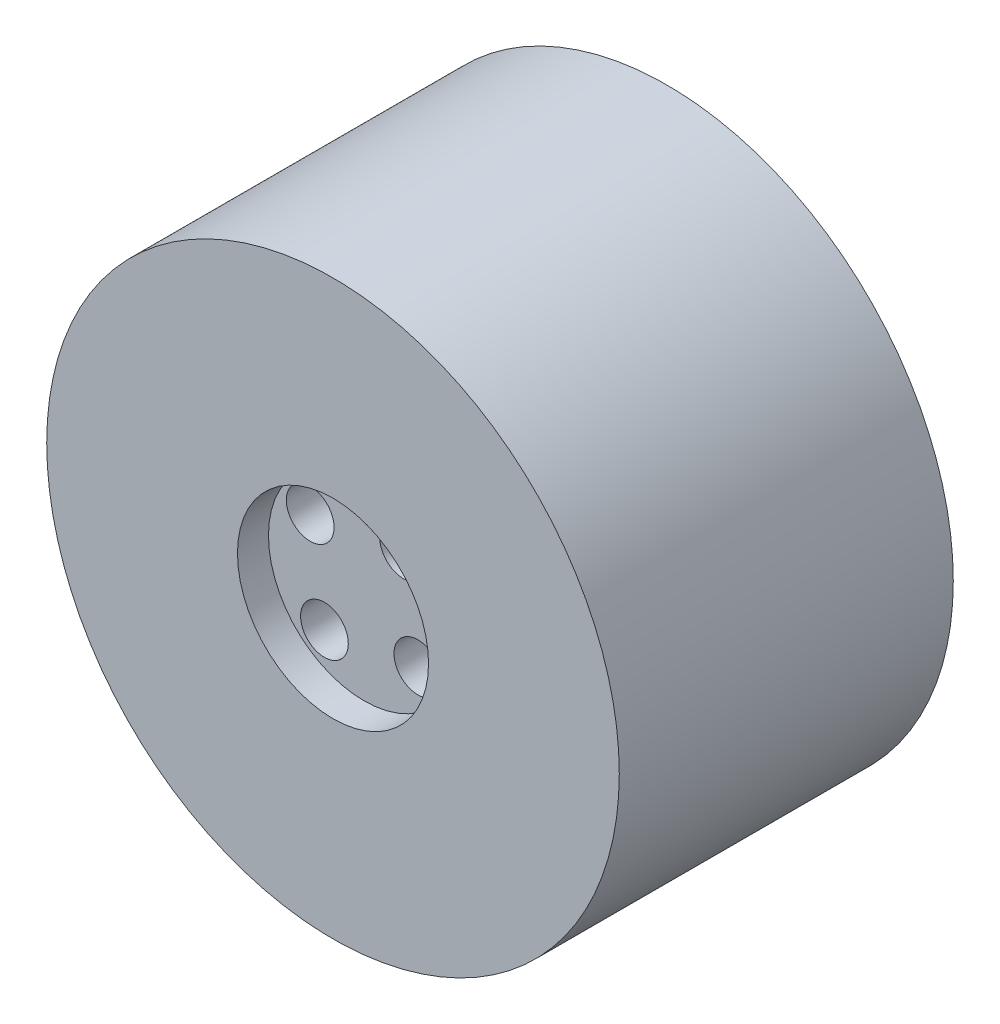
ISO-10303-21;
HEADER;
FILE_DESCRIPTION(('STEP AP214'),'2;1');
FILE_NAME('part.step','',(''),(''),'','','');
FILE_SCHEMA(('AUTOMOTIVE_DESIGN { 1 0 10303 214 1 1 1 1 }'));
ENDSEC;
DATA;
#1=APPLICATION_CONTEXT('core data for automotive mechanical design processes');
#2=APPLICATION_PROTOCOL_DEFINITION('international standard','automotive_design',2000,#1);
#3=PRODUCT_CONTEXT('',#1,'mechanical');
#4=PRODUCT('Part','Part','',(#3));
#5=PRODUCT_RELATED_PRODUCT_CATEGORY('part','',(#4));
#6=PRODUCT_DEFINITION_FORMATION('','',#4);
#7=PRODUCT_DEFINITION_CONTEXT('part definition',#1,'design');
#8=PRODUCT_DEFINITION('design','',#6,#7);
#9=PRODUCT_DEFINITION_SHAPE('','',#8);
#10=(LENGTH_UNIT() NAMED_UNIT(*) SI_UNIT(.MILLI.,.METRE.));
#11=(NAMED_UNIT(*) PLANE_ANGLE_UNIT() SI_UNIT($,.RADIAN.));
#12=(NAMED_UNIT(*) SI_UNIT($,.STERADIAN.) SOLID_ANGLE_UNIT());
#13=UNCERTAINTY_MEASURE_WITH_UNIT(LENGTH_MEASURE(1.E-05),#10,'distance_accuracy_value','');
#14=(GEOMETRIC_REPRESENTATION_CONTEXT(3) GLOBAL_UNCERTAINTY_ASSIGNED_CONTEXT((#13)) GLOBAL_UNIT_ASSIGNED_CONTEXT((#10,
#11,#12)) REPRESENTATION_CONTEXT('',''));
#15=CARTESIAN_POINT('',(0.,0.,0.));
#16=DIRECTION('',(0.,0.,1.));
#17=DIRECTION('',(1.,0.,0.));
#18=AXIS2_PLACEMENT_3D('',#15,#16,#17);
#19=CARTESIAN_POINT('',(0.,0.,70.));
#20=DIRECTION('',(0.,0.,-1.));
#21=DIRECTION('',(-1.,0.,0.));
#22=AXIS2_PLACEMENT_3D('',#19,#20,#21);
#23=CYLINDRICAL_SURFACE('',#22,60.);
#24=CARTESIAN_POINT('',(0.,0.,70.));
#25=DIRECTION('',(0.,0.,1.));
#26=DIRECTION('',(1.,0.,0.));
#27=AXIS2_PLACEMENT_3D('',#24,#25,#26);
#28=CIRCLE('',#27,60.);
#29=CARTESIAN_POINT('',(60.,0.,70.));
#30=VERTEX_POINT('',#29);
#31=EDGE_CURVE('E51',#30,#30,#28,.T.);
#32=ORIENTED_EDGE('',*,*,#31,.F.);
#33=EDGE_LOOP('',(#32));
#34=FACE_BOUND('',#33,.T.);
#35=CARTESIAN_POINT('',(0.,0.,0.));
#36=DIRECTION('',(0.,0.,1.));
#37=DIRECTION('',(1.,0.,0.));
#38=AXIS2_PLACEMENT_3D('',#35,#36,#37);
#39=CIRCLE('',#38,60.);
#40=CARTESIAN_POINT('',(60.,0.,0.));
#41=VERTEX_POINT('',#40);
#42=EDGE_CURVE('E46',#41,#41,#39,.T.);
#43=ORIENTED_EDGE('',*,*,#42,.T.);
#44=EDGE_LOOP('',(#43));
#45=FACE_BOUND('',#44,.T.);
#46=ADVANCED_FACE('F43',(#34,#45),#23,.T.);
#47=CARTESIAN_POINT('',(0.,0.,70.));
#48=DIRECTION('',(0.,0.,1.));
#49=DIRECTION('',(1.,0.,0.));
#50=AXIS2_PLACEMENT_3D('',#47,#48,#49);
#51=PLANE('',#50);
#52=CARTESIAN_POINT('',(0.,0.,70.));
#53=DIRECTION('',(0.,0.,1.));
#54=DIRECTION('',(1.,0.,0.));
#55=AXIS2_PLACEMENT_3D('',#52,#53,#54);
#56=CIRCLE('',#55,20.02);
#57=CARTESIAN_POINT('',(20.02,0.,70.));
#58=VERTEX_POINT('',#57);
#59=EDGE_CURVE('E65',#58,#58,#56,.T.);
#60=ORIENTED_EDGE('',*,*,#59,.F.);
#61=EDGE_LOOP('',(#60));
#62=FACE_BOUND('',#61,.T.);
#63=ORIENTED_EDGE('',*,*,#31,.T.);
#64=EDGE_LOOP('',(#63));
#65=FACE_BOUND('',#64,.T.);
#66=ADVANCED_FACE('F124',(#62,#65),#51,.T.);
#67=CARTESIAN_POINT('',(0.,0.,0.));
#68=DIRECTION('',(0.,0.,1.));
#69=DIRECTION('',(1.,0.,0.));
#70=AXIS2_PLACEMENT_3D('',#67,#68,#69);
#71=PLANE('',#70);
#72=CARTESIAN_POINT('',(0.,0.,0.));
#73=DIRECTION('',(0.,0.,-1.));
#74=DIRECTION('',(-1.,0.,0.));
#75=AXIS2_PLACEMENT_3D('',#72,#73,#74);
#76=CIRCLE('',#75,20.);
#77=CARTESIAN_POINT('',(-20.,0.,0.));
#78=VERTEX_POINT('',#77);
#79=EDGE_CURVE('E10',#78,#78,#76,.T.);
#80=ORIENTED_EDGE('',*,*,#79,.F.);
#81=EDGE_LOOP('',(#80));
#82=FACE_BOUND('',#81,.T.);
#83=ORIENTED_EDGE('',*,*,#42,.F.);
#84=EDGE_LOOP('',(#83));
#85=FACE_BOUND('',#84,.T.);
#86=ADVANCED_FACE('F129',(#82,#85),#71,.F.);
#87=CARTESIAN_POINT('',(0.,0.,63.5));
#88=DIRECTION('',(0.,0.,1.));
#89=DIRECTION('',(1.,0.,0.));
#90=AXIS2_PLACEMENT_3D('',#87,#88,#89);
#91=CYLINDRICAL_SURFACE('',#90,20.02);
#92=CARTESIAN_POINT('',(0.,0.,63.5));
#93=DIRECTION('',(0.,0.,1.));
#94=DIRECTION('',(1.,0.,0.));
#95=AXIS2_PLACEMENT_3D('',#92,#93,#94);
#96=CIRCLE('',#95,20.02);
#97=CARTESIAN_POINT('',(20.02,0.,63.5));
#98=VERTEX_POINT('',#97);
#99=EDGE_CURVE('E61',#98,#98,#96,.T.);
#100=CARTESIAN_POINT('',(20.02,0.,63.5));
#101=CARTESIAN_POINT('',(20.02,0.,63.5677083333333));
#102=CARTESIAN_POINT('',(20.02,0.,63.6354166666667));
#103=CARTESIAN_POINT('',(20.02,0.,63.7708333333333));
#104=CARTESIAN_POINT('',(20.02,0.,63.8385416666667));
#105=CARTESIAN_POINT('',(20.02,0.,63.9739583333333));
#106=CARTESIAN_POINT('',(20.02,0.,64.0416666666667));
#107=CARTESIAN_POINT('',(20.02,0.,64.1770833333333));
#108=CARTESIAN_POINT('',(20.02,0.,64.2447916666667));
#109=CARTESIAN_POINT('',(20.02,0.,64.3802083333333));
#110=CARTESIAN_POINT('',(20.02,0.,64.4479166666667));
#111=CARTESIAN_POINT('',(20.02,0.,64.5833333333333));
#112=CARTESIAN_POINT('',(20.02,0.,64.6510416666667));
#113=CARTESIAN_POINT('',(20.02,0.,64.7864583333333));
#114=CARTESIAN_POINT('',(20.02,0.,64.8541666666667));
#115=CARTESIAN_POINT('',(20.02,0.,64.9895833333333));
#116=CARTESIAN_POINT('',(20.02,0.,65.0572916666667));
#117=CARTESIAN_POINT('',(20.02,0.,65.1927083333333));
#118=CARTESIAN_POINT('',(20.02,0.,65.2604166666667));
#119=CARTESIAN_POINT('',(20.02,0.,65.3958333333333));
#120=CARTESIAN_POINT('',(20.02,0.,65.4635416666667));
#121=CARTESIAN_POINT('',(20.02,0.,65.5989583333333));
#122=CARTESIAN_POINT('',(20.02,0.,65.6666666666667));
#123=CARTESIAN_POINT('',(20.02,0.,65.8020833333333));
#124=CARTESIAN_POINT('',(20.02,0.,65.8697916666667));
#125=CARTESIAN_POINT('',(20.02,0.,66.0052083333333));
#126=CARTESIAN_POINT('',(20.02,0.,66.0729166666667));
#127=CARTESIAN_POINT('',(20.02,0.,66.2083333333333));
#128=CARTESIAN_POINT('',(20.02,0.,66.2760416666667));
#129=CARTESIAN_POINT('',(20.02,0.,66.4114583333333));
#130=CARTESIAN_POINT('',(20.02,0.,66.4791666666667));
#131=CARTESIAN_POINT('',(20.02,0.,66.6145833333333));
#132=CARTESIAN_POINT('',(20.02,0.,66.6822916666667));
#133=CARTESIAN_POINT('',(20.02,0.,66.8177083333333));
#134=CARTESIAN_POINT('',(20.02,0.,66.8854166666667));
#135=CARTESIAN_POINT('',(20.02,0.,67.0208333333333));
#136=CARTESIAN_POINT('',(20.02,0.,67.0885416666667));
#137=CARTESIAN_POINT('',(20.02,0.,67.2239583333333));
#138=CARTESIAN_POINT('',(20.02,0.,67.2916666666667));
#139=CARTESIAN_POINT('',(20.02,0.,67.4270833333333));
#140=CARTESIAN_POINT('',(20.02,0.,67.4947916666667));
#141=CARTESIAN_POINT('',(20.02,0.,67.6302083333333));
#142=CARTESIAN_POINT('',(20.02,0.,67.6979166666667));
#143=CARTESIAN_POINT('',(20.02,0.,67.8333333333333));
#144=CARTESIAN_POINT('',(20.02,0.,67.9010416666667));
#145=CARTESIAN_POINT('',(20.02,0.,68.0364583333333));
#146=CARTESIAN_POINT('',(20.02,0.,68.1041666666667));
#147=CARTESIAN_POINT('',(20.02,0.,68.2395833333333));
#148=CARTESIAN_POINT('',(20.02,0.,68.3072916666667));
#149=CARTESIAN_POINT('',(20.02,0.,68.4427083333333));
#150=CARTESIAN_POINT('',(20.02,0.,68.5104166666667));
#151=CARTESIAN_POINT('',(20.02,0.,68.6458333333333));
#152=CARTESIAN_POINT('',(20.02,0.,68.7135416666667));
#153=CARTESIAN_POINT('',(20.02,0.,68.8489583333333));
#154=CARTESIAN_POINT('',(20.02,0.,68.9166666666667));
#155=CARTESIAN_POINT('',(20.02,0.,69.0520833333333));
#156=CARTESIAN_POINT('',(20.02,0.,69.1197916666667));
#157=CARTESIAN_POINT('',(20.02,0.,69.2552083333333));
#158=CARTESIAN_POINT('',(20.02,0.,69.3229166666667));
#159=CARTESIAN_POINT('',(20.02,0.,69.4583333333333));
#160=CARTESIAN_POINT('',(20.02,0.,69.5260416666667));
#161=CARTESIAN_POINT('',(20.02,0.,69.6614583333333));
#162=CARTESIAN_POINT('',(20.02,0.,69.7291666666667));
#163=CARTESIAN_POINT('',(20.02,0.,69.8645833333333));
#164=CARTESIAN_POINT('',(20.02,0.,69.9322916666667));
#165=CARTESIAN_POINT('',(20.02,0.,70.));
#166=B_SPLINE_CURVE_WITH_KNOTS('',3,(#100,#101,#102,#103,#104,#105,#106,#107,#108,#109,#110,
#111,#112,#113,#114,#115,#116,#117,#118,#119,#120,#121,#122,#123,#124,#125,#126,#127,#128,#129,
#130,#131,#132,#133,#134,#135,#136,#137,#138,#139,#140,#141,#142,#143,#144,#145,#146,#147,#148,
#149,#150,#151,#152,#153,#154,#155,#156,#157,#158,#159,#160,#161,#162,#163,#164,#165),
.UNSPECIFIED.,.F.,.F.,(4,2,2,2,2,2,2,2,2,2,2,2,2,2,2,2,2,2,2,2,2,2,2,2,2,2,2,2,2,2,2,2,4),(0.,
0.203124999999998,0.406249999999997,0.609374999999995,0.812499999999994,1.01562499999999,
1.21874999999999,1.42187499999999,1.62499999999999,1.828125,2.03125,2.234375,2.4375,
2.64062499999999,2.84374999999999,3.04687499999999,3.24999999999999,3.453125,3.65625,3.859375,
4.0625,4.26562499999999,4.46874999999999,4.67187499999999,4.87499999999999,5.078125,5.28125,
5.484375,5.6875,5.890625,6.09374999999999,6.29687499999999,6.49999999999999),.UNSPECIFIED.);
#167=EDGE_CURVE('BSEAM139',#98,#58,#166,.T.);
#168=ORIENTED_EDGE('',*,*,#99,.F.);
#169=ORIENTED_EDGE('',*,*,#59,.T.);
#170=ORIENTED_EDGE('',*,*,#167,.T.);
#171=ORIENTED_EDGE('',*,*,#167,.F.);
#172=EDGE_LOOP('',(#168,#170,#169,#171));
#173=FACE_BOUND('',#172,.T.);
#174=ADVANCED_FACE('F139',(#173),#91,.F.);
#175=CARTESIAN_POINT('',(0.,0.,63.5));
#176=DIRECTION('',(0.,0.,1.));
#177=DIRECTION('',(1.,0.,0.));
#178=AXIS2_PLACEMENT_3D('',#175,#176,#177);
#179=PLANE('',#178);
#180=CARTESIAN_POINT('',(-8.29451145609633,-11.2783456102696,63.5));
#181=DIRECTION('',(0.,0.,1.));
#182=DIRECTION('',(1.,0.,0.));
#183=AXIS2_PLACEMENT_3D('',#180,#181,#182);
#184=CIRCLE('',#183,5.);
#185=CARTESIAN_POINT('',(-3.29451145609633,-11.2783456102696,63.5));
#186=VERTEX_POINT('',#185);
#187=EDGE_CURVE('E82',#186,#186,#184,.T.);
#188=ORIENTED_EDGE('',*,*,#187,.F.);
#189=EDGE_LOOP('',(#188));
#190=FACE_BOUND('',#189,.T.);
#191=CARTESIAN_POINT('',(11.2783456102695,-8.29451145609637,63.5));
#192=DIRECTION('',(0.,0.,1.));
#193=DIRECTION('',(1.,0.,0.));
#194=AXIS2_PLACEMENT_3D('',#191,#192,#193);
#195=CIRCLE('',#194,5.);
#196=CARTESIAN_POINT('',(16.2783456102695,-8.29451145609637,63.5));
#197=VERTEX_POINT('',#196);
#198=EDGE_CURVE('E88',#197,#197,#195,.T.);
#199=ORIENTED_EDGE('',*,*,#198,.F.);
#200=EDGE_LOOP('',(#199));
#201=FACE_BOUND('',#200,.T.);
#202=CARTESIAN_POINT('',(8.29451145609625,11.2783456102696,63.5));
#203=DIRECTION('',(0.,0.,1.));
#204=DIRECTION('',(1.,0.,0.));
#205=AXIS2_PLACEMENT_3D('',#202,#203,#204);
#206=CIRCLE('',#205,5.);
#207=CARTESIAN_POINT('',(13.2945114560963,11.2783456102696,63.5));
#208=VERTEX_POINT('',#207);
#209=EDGE_CURVE('E92',#208,#208,#206,.T.);
#210=ORIENTED_EDGE('',*,*,#209,.F.);
#211=EDGE_LOOP('',(#210));
#212=FACE_BOUND('',#211,.T.);
#213=CARTESIAN_POINT('',(-11.2783456102695,8.29451145609637,63.5));
#214=DIRECTION('',(0.,0.,1.));
#215=DIRECTION('',(1.,0.,0.));
#216=AXIS2_PLACEMENT_3D('',#213,#214,#215);
#217=CIRCLE('',#216,5.);
#218=CARTESIAN_POINT('',(-6.27834561026953,8.29451145609637,63.5));
#219=VERTEX_POINT('',#218);
#220=EDGE_CURVE('E72',#219,#219,#217,.T.);
#221=ORIENTED_EDGE('',*,*,#220,.F.);
#222=EDGE_LOOP('',(#221));
#223=FACE_BOUND('',#222,.T.);
#224=ORIENTED_EDGE('',*,*,#99,.T.);
#225=EDGE_LOOP('',(#224));
#226=FACE_BOUND('',#225,.T.);
#227=ADVANCED_FACE('F145',(#190,#201,#212,#223,#226),#179,.T.);
#228=CARTESIAN_POINT('',(0.,0.,-6.));
#229=DIRECTION('',(0.,0.,1.));
#230=DIRECTION('',(1.,0.,0.));
#231=AXIS2_PLACEMENT_3D('',#228,#229,#230);
#232=CYLINDRICAL_SURFACE('',#231,20.);
#233=CARTESIAN_POINT('',(0.,0.,-6.));
#234=DIRECTION('',(0.,0.,-1.));
#235=DIRECTION('',(-1.,0.,0.));
#236=AXIS2_PLACEMENT_3D('',#233,#234,#235);
#237=CIRCLE('',#236,20.);
#238=CARTESIAN_POINT('',(-20.,0.,-6.));
#239=VERTEX_POINT('',#238);
#240=EDGE_CURVE('E59',#239,#239,#237,.T.);
#241=ORIENTED_EDGE('',*,*,#240,.F.);
#242=EDGE_LOOP('',(#241));
#243=FACE_BOUND('',#242,.T.);
#244=ORIENTED_EDGE('',*,*,#79,.T.);
#245=EDGE_LOOP('',(#244));
#246=FACE_BOUND('',#245,.T.);
#247=ADVANCED_FACE('F151',(#243,#246),#232,.T.);
#248=CARTESIAN_POINT('',(0.,0.,-6.));
#249=DIRECTION('',(0.,0.,-1.));
#250=DIRECTION('',(-1.,0.,0.));
#251=AXIS2_PLACEMENT_3D('',#248,#249,#250);
#252=PLANE('',#251);
#253=CARTESIAN_POINT('',(-8.29451145609633,-11.2783456102696,-6.00000000000001));
#254=DIRECTION('',(0.,0.,1.));
#255=DIRECTION('',(0.,1.,0.));
#256=AXIS2_PLACEMENT_3D('',#253,#254,#255);
#257=CIRCLE('',#256,5.);
#258=CARTESIAN_POINT('',(-8.29451145609635,-6.27834561026956,-6.00000000000001));
#259=VERTEX_POINT('',#258);
#260=EDGE_CURVE('E96',#259,#259,#257,.T.);
#261=ORIENTED_EDGE('',*,*,#260,.T.);
#262=EDGE_LOOP('',(#261));
#263=FACE_BOUND('',#262,.T.);
#264=CARTESIAN_POINT('',(11.2783456102695,-8.29451145609637,-6.00000000000001));
#265=DIRECTION('',(0.,0.,1.));
#266=DIRECTION('',(-1.,0.,0.));
#267=AXIS2_PLACEMENT_3D('',#264,#265,#266);
#268=CIRCLE('',#267,5.);
#269=CARTESIAN_POINT('',(6.27834561026953,-8.29451145609637,-6.00000000000001));
#270=VERTEX_POINT('',#269);
#271=EDGE_CURVE('E101',#270,#270,#268,.T.);
#272=ORIENTED_EDGE('',*,*,#271,.T.);
#273=EDGE_LOOP('',(#272));
#274=FACE_BOUND('',#273,.T.);
#275=CARTESIAN_POINT('',(8.29451145609625,11.2783456102696,-6.00000000000001));
#276=DIRECTION('',(0.,0.,1.));
#277=DIRECTION('',(0.,-1.,0.));
#278=AXIS2_PLACEMENT_3D('',#275,#276,#277);
#279=CIRCLE('',#278,5.);
#280=CARTESIAN_POINT('',(8.2945114560963,6.27834561026962,-6.00000000000001));
#281=VERTEX_POINT('',#280);
#282=EDGE_CURVE('E97',#281,#281,#279,.T.);
#283=ORIENTED_EDGE('',*,*,#282,.T.);
#284=EDGE_LOOP('',(#283));
#285=FACE_BOUND('',#284,.T.);
#286=CARTESIAN_POINT('',(-11.2783456102695,8.29451145609637,-6.00000000000001));
#287=DIRECTION('',(0.,0.,1.));
#288=DIRECTION('',(1.,0.,0.));
#289=AXIS2_PLACEMENT_3D('',#286,#287,#288);
#290=CIRCLE('',#289,5.);
#291=CARTESIAN_POINT('',(-6.27834561026953,8.29451145609637,-6.00000000000001));
#292=VERTEX_POINT('',#291);
#293=EDGE_CURVE('E77',#292,#292,#290,.T.);
#294=ORIENTED_EDGE('',*,*,#293,.T.);
#295=EDGE_LOOP('',(#294));
#296=FACE_BOUND('',#295,.T.);
#297=ORIENTED_EDGE('',*,*,#240,.T.);
#298=EDGE_LOOP('',(#297));
#299=FACE_BOUND('',#298,.T.);
#300=ADVANCED_FACE('F109',(#263,#274,#285,#296,#299),#252,.T.);
#301=CARTESIAN_POINT('',(-11.2783456102695,8.29451145609637,-6.00000000000001));
#302=DIRECTION('',(0.,0.,1.));
#303=DIRECTION('',(1.,0.,0.));
#304=AXIS2_PLACEMENT_3D('',#301,#302,#303);
#305=CYLINDRICAL_SURFACE('',#304,5.);
#306=ORIENTED_EDGE('',*,*,#220,.T.);
#307=EDGE_LOOP('',(#306));
#308=FACE_BOUND('',#307,.T.);
#309=ORIENTED_EDGE('',*,*,#293,.F.);
#310=EDGE_LOOP('',(#309));
#311=FACE_BOUND('',#310,.T.);
#312=ADVANCED_FACE('F157',(#308,#311),#305,.F.);
#313=CARTESIAN_POINT('',(8.29451145609625,11.2783456102696,-6.00000000000001));
#314=DIRECTION('',(0.,0.,1.));
#315=DIRECTION('',(1.,0.,0.));
#316=AXIS2_PLACEMENT_3D('',#313,#314,#315);
#317=CYLINDRICAL_SURFACE('',#316,5.);
#318=ORIENTED_EDGE('',*,*,#209,.T.);
#319=EDGE_LOOP('',(#318));
#320=FACE_BOUND('',#319,.T.);
#321=ORIENTED_EDGE('',*,*,#282,.F.);
#322=EDGE_LOOP('',(#321));
#323=FACE_BOUND('',#322,.T.);
#324=ADVANCED_FACE('F120',(#320,#323),#317,.F.);
#325=CARTESIAN_POINT('',(11.2783456102695,-8.29451145609637,-6.00000000000001));
#326=DIRECTION('',(0.,0.,1.));
#327=DIRECTION('',(1.,0.,0.));
#328=AXIS2_PLACEMENT_3D('',#325,#326,#327);
#329=CYLINDRICAL_SURFACE('',#328,5.);
#330=ORIENTED_EDGE('',*,*,#198,.T.);
#331=EDGE_LOOP('',(#330));
#332=FACE_BOUND('',#331,.T.);
#333=ORIENTED_EDGE('',*,*,#271,.F.);
#334=EDGE_LOOP('',(#333));
#335=FACE_BOUND('',#334,.T.);
#336=ADVANCED_FACE('F114',(#332,#335),#329,.F.);
#337=CARTESIAN_POINT('',(-8.29451145609633,-11.2783456102696,-6.00000000000001));
#338=DIRECTION('',(0.,0.,1.));
#339=DIRECTION('',(1.,0.,0.));
#340=AXIS2_PLACEMENT_3D('',#337,#338,#339);
#341=CYLINDRICAL_SURFACE('',#340,5.);
#342=ORIENTED_EDGE('',*,*,#187,.T.);
#343=EDGE_LOOP('',(#342));
#344=FACE_BOUND('',#343,.T.);
#345=ORIENTED_EDGE('',*,*,#260,.F.);
#346=EDGE_LOOP('',(#345));
#347=FACE_BOUND('',#346,.T.);
#348=ADVANCED_FACE('F112',(#344,#347),#341,.F.);
#349=CLOSED_SHELL('',(#46,#66,#86,#174,#227,#247,#300,#312,#324,#336,#348));
#350=MANIFOLD_SOLID_BREP('B2',#349);
#351=ADVANCED_BREP_SHAPE_REPRESENTATION('',(#18,#350),#14);
#352=SHAPE_DEFINITION_REPRESENTATION(#9,#351);
ENDSEC;
END-ISO-10303-21;
